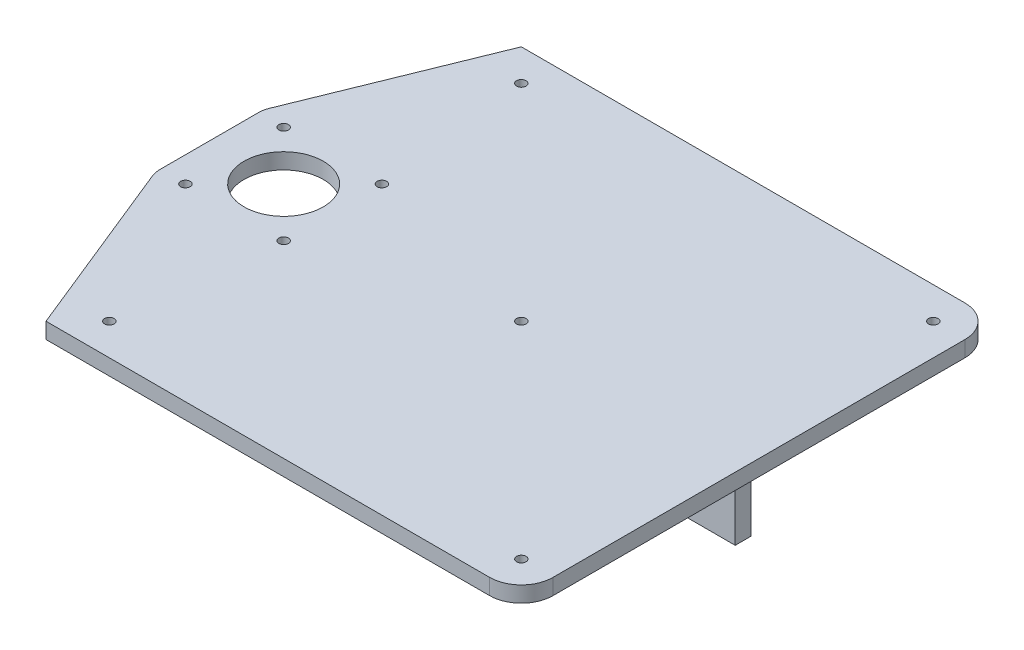
ISO-10303-21;
HEADER;
FILE_DESCRIPTION(('STEP AP214'),'2;1');
FILE_NAME('part.step','',(''),(''),'','','');
FILE_SCHEMA(('AUTOMOTIVE_DESIGN { 1 0 10303 214 1 1 1 1 }'));
ENDSEC;
DATA;
#1=APPLICATION_CONTEXT('core data for automotive mechanical design processes');
#2=APPLICATION_PROTOCOL_DEFINITION('international standard','automotive_design',2000,#1);
#3=PRODUCT_CONTEXT('',#1,'mechanical');
#4=PRODUCT('Part','Part','',(#3));
#5=PRODUCT_RELATED_PRODUCT_CATEGORY('part','',(#4));
#6=PRODUCT_DEFINITION_FORMATION('','',#4);
#7=PRODUCT_DEFINITION_CONTEXT('part definition',#1,'design');
#8=PRODUCT_DEFINITION('design','',#6,#7);
#9=PRODUCT_DEFINITION_SHAPE('','',#8);
#10=(LENGTH_UNIT() NAMED_UNIT(*) SI_UNIT(.MILLI.,.METRE.));
#11=(NAMED_UNIT(*) PLANE_ANGLE_UNIT() SI_UNIT($,.RADIAN.));
#12=(NAMED_UNIT(*) SI_UNIT($,.STERADIAN.) SOLID_ANGLE_UNIT());
#13=UNCERTAINTY_MEASURE_WITH_UNIT(LENGTH_MEASURE(1.E-05),#10,'distance_accuracy_value','');
#14=(GEOMETRIC_REPRESENTATION_CONTEXT(3) GLOBAL_UNCERTAINTY_ASSIGNED_CONTEXT((#13)) GLOBAL_UNIT_ASSIGNED_CONTEXT((#10,
#11,#12)) REPRESENTATION_CONTEXT('',''));
#15=CARTESIAN_POINT('',(0.,0.,0.));
#16=DIRECTION('',(0.,0.,1.));
#17=DIRECTION('',(1.,0.,0.));
#18=AXIS2_PLACEMENT_3D('',#15,#16,#17);
#19=CARTESIAN_POINT('',(65.,5.,65.));
#20=DIRECTION('',(0.,1.,0.));
#21=DIRECTION('',(0.,0.,1.));
#22=AXIS2_PLACEMENT_3D('',#19,#20,#21);
#23=PLANE('',#22);
#24=CARTESIAN_POINT('',(-65.,5.,65.));
#25=DIRECTION('',(0.,1.,0.));
#26=DIRECTION('',(0.,0.,1.));
#27=AXIS2_PLACEMENT_3D('',#24,#25,#26);
#28=CIRCLE('',#27,1.5);
#29=CARTESIAN_POINT('',(-65.,5.,66.5));
#30=VERTEX_POINT('',#29);
#31=EDGE_CURVE('E240',#30,#30,#28,.T.);
#32=ORIENTED_EDGE('',*,*,#31,.F.);
#33=EDGE_LOOP('',(#32));
#34=FACE_BOUND('',#33,.T.);
#35=CARTESIAN_POINT('',(65.,5.,-65.));
#36=DIRECTION('',(0.,1.,0.));
#37=DIRECTION('',(0.,0.,1.));
#38=AXIS2_PLACEMENT_3D('',#35,#36,#37);
#39=CIRCLE('',#38,1.5);
#40=CARTESIAN_POINT('',(65.,5.,-63.5));
#41=VERTEX_POINT('',#40);
#42=EDGE_CURVE('E252',#41,#41,#39,.T.);
#43=ORIENTED_EDGE('',*,*,#42,.F.);
#44=EDGE_LOOP('',(#43));
#45=FACE_BOUND('',#44,.T.);
#46=CARTESIAN_POINT('',(-65.,5.,-65.));
#47=DIRECTION('',(0.,1.,0.));
#48=DIRECTION('',(0.,0.,1.));
#49=AXIS2_PLACEMENT_3D('',#46,#47,#48);
#50=CIRCLE('',#49,1.5);
#51=CARTESIAN_POINT('',(-65.,5.,-63.5));
#52=VERTEX_POINT('',#51);
#53=EDGE_CURVE('E264',#52,#52,#50,.T.);
#54=ORIENTED_EDGE('',*,*,#53,.F.);
#55=EDGE_LOOP('',(#54));
#56=FACE_BOUND('',#55,.T.);
#57=CARTESIAN_POINT('',(-59.5,5.,15.5));
#58=DIRECTION('',(0.,1.,0.));
#59=DIRECTION('',(0.,0.,1.));
#60=AXIS2_PLACEMENT_3D('',#57,#58,#59);
#61=CIRCLE('',#60,1.5);
#62=CARTESIAN_POINT('',(-59.5,5.,17.));
#63=VERTEX_POINT('',#62);
#64=EDGE_CURVE('E276',#63,#63,#61,.T.);
#65=ORIENTED_EDGE('',*,*,#64,.F.);
#66=EDGE_LOOP('',(#65));
#67=FACE_BOUND('',#66,.T.);
#68=CARTESIAN_POINT('',(-90.5,5.,-15.5));
#69=DIRECTION('',(0.,1.,0.));
#70=DIRECTION('',(0.,0.,1.));
#71=AXIS2_PLACEMENT_3D('',#68,#69,#70);
#72=CIRCLE('',#71,1.5);
#73=CARTESIAN_POINT('',(-90.5,5.,-14.));
#74=VERTEX_POINT('',#73);
#75=EDGE_CURVE('E158',#74,#74,#72,.T.);
#76=ORIENTED_EDGE('',*,*,#75,.F.);
#77=EDGE_LOOP('',(#76));
#78=FACE_BOUND('',#77,.T.);
#79=DIRECTION('',(0.375857189718503,0.,0.926677599241996));
#80=VECTOR('',#79,1.);
#81=CARTESIAN_POINT('',(-97.913420793936,5.,18.506857517748));
#82=LINE('',#81,#80);
#83=CARTESIAN_POINT('',(-97.913420793936,5.,18.506857517748));
#84=VERTEX_POINT('',#83);
#85=CARTESIAN_POINT('',(-75.,5.,75.));
#86=VERTEX_POINT('',#85);
#87=EDGE_CURVE('E174',#84,#86,#82,.T.);
#88=ORIENTED_EDGE('',*,*,#87,.T.);
#89=DIRECTION('',(1.,0.,0.));
#90=VECTOR('',#89,1.);
#91=CARTESIAN_POINT('',(-75.,5.,75.));
#92=LINE('',#91,#90);
#93=CARTESIAN_POINT('',(65.,5.,75.));
#94=VERTEX_POINT('',#93);
#95=EDGE_CURVE('E105',#86,#94,#92,.T.);
#96=ORIENTED_EDGE('',*,*,#95,.T.);
#97=CARTESIAN_POINT('',(65.,5.,65.));
#98=DIRECTION('',(0.,1.,0.));
#99=DIRECTION('',(0.,0.,1.));
#100=AXIS2_PLACEMENT_3D('',#97,#98,#99);
#101=CIRCLE('',#100,10.);
#102=CARTESIAN_POINT('',(75.,5.,65.));
#103=VERTEX_POINT('',#102);
#104=EDGE_CURVE('E294',#94,#103,#101,.T.);
#105=ORIENTED_EDGE('',*,*,#104,.T.);
#106=DIRECTION('',(0.,0.,-1.));
#107=VECTOR('',#106,1.);
#108=CARTESIAN_POINT('',(75.,5.,65.));
#109=LINE('',#108,#107);
#110=CARTESIAN_POINT('',(75.,5.,-65.));
#111=VERTEX_POINT('',#110);
#112=EDGE_CURVE('E296',#103,#111,#109,.T.);
#113=ORIENTED_EDGE('',*,*,#112,.T.);
#114=CARTESIAN_POINT('',(65.,5.,-65.));
#115=DIRECTION('',(0.,1.,0.));
#116=DIRECTION('',(0.,0.,-1.));
#117=AXIS2_PLACEMENT_3D('',#114,#115,#116);
#118=CIRCLE('',#117,10.);
#119=CARTESIAN_POINT('',(65.,5.,-75.));
#120=VERTEX_POINT('',#119);
#121=EDGE_CURVE('E298',#111,#120,#118,.T.);
#122=ORIENTED_EDGE('',*,*,#121,.T.);
#123=DIRECTION('',(-1.,0.,0.));
#124=VECTOR('',#123,1.);
#125=CARTESIAN_POINT('',(-75.,5.,-75.));
#126=LINE('',#125,#124);
#127=CARTESIAN_POINT('',(-75.,5.,-75.));
#128=VERTEX_POINT('',#127);
#129=EDGE_CURVE('E300',#120,#128,#126,.T.);
#130=ORIENTED_EDGE('',*,*,#129,.T.);
#131=DIRECTION('',(-0.375857189718503,0.,0.926677599241996));
#132=VECTOR('',#131,1.);
#133=CARTESIAN_POINT('',(-97.913420793936,5.,-18.506857517748));
#134=LINE('',#133,#132);
#135=CARTESIAN_POINT('',(-97.913420793936,5.,-18.506857517748));
#136=VERTEX_POINT('',#135);
#137=EDGE_CURVE('E133',#128,#136,#134,.T.);
#138=ORIENTED_EDGE('',*,*,#137,.T.);
#139=CARTESIAN_POINT('',(-90.5,5.,-15.5));
#140=DIRECTION('',(0.,1.,0.));
#141=DIRECTION('',(0.,0.,-1.));
#142=AXIS2_PLACEMENT_3D('',#139,#140,#141);
#143=CIRCLE('',#142,7.99999999999999);
#144=CARTESIAN_POINT('',(-98.5,5.,-15.5));
#145=VERTEX_POINT('',#144);
#146=EDGE_CURVE('E126',#136,#145,#143,.T.);
#147=ORIENTED_EDGE('',*,*,#146,.T.);
#148=DIRECTION('',(0.,0.,1.));
#149=VECTOR('',#148,1.);
#150=CARTESIAN_POINT('',(-98.5,5.,15.5));
#151=LINE('',#150,#149);
#152=CARTESIAN_POINT('',(-98.5,5.,15.5));
#153=VERTEX_POINT('',#152);
#154=EDGE_CURVE('E130',#145,#153,#151,.T.);
#155=ORIENTED_EDGE('',*,*,#154,.T.);
#156=CARTESIAN_POINT('',(-90.5,5.,15.5));
#157=DIRECTION('',(0.,1.,0.));
#158=DIRECTION('',(0.,0.,1.));
#159=AXIS2_PLACEMENT_3D('',#156,#157,#158);
#160=CIRCLE('',#159,8.00000000000001);
#161=EDGE_CURVE('E57',#153,#84,#160,.T.);
#162=ORIENTED_EDGE('',*,*,#161,.T.);
#163=EDGE_LOOP('',(#88,#96,#105,#113,#122,#130,#138,#147,#155,#162));
#164=FACE_BOUND('',#163,.T.);
#165=CARTESIAN_POINT('',(-90.5,5.,15.5));
#166=DIRECTION('',(0.,1.,0.));
#167=DIRECTION('',(0.,0.,1.));
#168=AXIS2_PLACEMENT_3D('',#165,#166,#167);
#169=CIRCLE('',#168,1.50000000000001);
#170=CARTESIAN_POINT('',(-90.5,5.,17.));
#171=VERTEX_POINT('',#170);
#172=EDGE_CURVE('E282',#171,#171,#169,.T.);
#173=ORIENTED_EDGE('',*,*,#172,.F.);
#174=EDGE_LOOP('',(#173));
#175=FACE_BOUND('',#174,.T.);
#176=CARTESIAN_POINT('',(-59.5,5.,-15.5));
#177=DIRECTION('',(0.,1.,0.));
#178=DIRECTION('',(0.,0.,1.));
#179=AXIS2_PLACEMENT_3D('',#176,#177,#178);
#180=CIRCLE('',#179,1.5);
#181=CARTESIAN_POINT('',(-59.5,5.,-14.));
#182=VERTEX_POINT('',#181);
#183=EDGE_CURVE('E270',#182,#182,#180,.T.);
#184=ORIENTED_EDGE('',*,*,#183,.F.);
#185=EDGE_LOOP('',(#184));
#186=FACE_BOUND('',#185,.T.);
#187=CARTESIAN_POINT('',(-75.,5.,0.));
#188=DIRECTION('',(0.,1.,0.));
#189=DIRECTION('',(0.,0.,1.));
#190=AXIS2_PLACEMENT_3D('',#187,#188,#189);
#191=CIRCLE('',#190,12.5);
#192=CARTESIAN_POINT('',(-75.,5.,12.5));
#193=VERTEX_POINT('',#192);
#194=EDGE_CURVE('E258',#193,#193,#191,.T.);
#195=ORIENTED_EDGE('',*,*,#194,.F.);
#196=EDGE_LOOP('',(#195));
#197=FACE_BOUND('',#196,.T.);
#198=CARTESIAN_POINT('',(65.,5.,65.));
#199=DIRECTION('',(0.,1.,0.));
#200=DIRECTION('',(0.,0.,1.));
#201=AXIS2_PLACEMENT_3D('',#198,#199,#200);
#202=CIRCLE('',#201,1.5);
#203=CARTESIAN_POINT('',(65.,5.,66.5));
#204=VERTEX_POINT('',#203);
#205=EDGE_CURVE('E246',#204,#204,#202,.T.);
#206=ORIENTED_EDGE('',*,*,#205,.F.);
#207=EDGE_LOOP('',(#206));
#208=FACE_BOUND('',#207,.T.);
#209=CARTESIAN_POINT('',(0.,5.,0.));
#210=DIRECTION('',(0.,1.,0.));
#211=DIRECTION('',(0.,0.,1.));
#212=AXIS2_PLACEMENT_3D('',#209,#210,#211);
#213=CIRCLE('',#212,1.5);
#214=CARTESIAN_POINT('',(0.,5.,1.5));
#215=VERTEX_POINT('',#214);
#216=EDGE_CURVE('E234',#215,#215,#213,.T.);
#217=ORIENTED_EDGE('',*,*,#216,.F.);
#218=EDGE_LOOP('',(#217));
#219=FACE_BOUND('',#218,.T.);
#220=ADVANCED_FACE('F33',(#34,#45,#56,#67,#78,#164,#175,#186,#197,#208,#219),#23,.T.);
#221=CARTESIAN_POINT('',(65.,0.,65.));
#222=DIRECTION('',(0.,1.,0.));
#223=DIRECTION('',(0.,0.,1.));
#224=AXIS2_PLACEMENT_3D('',#221,#222,#223);
#225=PLANE('',#224);
#226=DIRECTION('',(1.,0.,0.));
#227=VECTOR('',#226,1.);
#228=CARTESIAN_POINT('',(65.,0.,2.49999999999999));
#229=LINE('',#228,#227);
#230=CARTESIAN_POINT('',(50.,0.,2.49999999999999));
#231=VERTEX_POINT('',#230);
#232=CARTESIAN_POINT('',(70.,0.,2.49999999999999));
#233=VERTEX_POINT('',#232);
#234=EDGE_CURVE('E41',#231,#233,#229,.T.);
#235=ORIENTED_EDGE('',*,*,#234,.T.);
#236=DIRECTION('',(0.,0.,-1.));
#237=VECTOR('',#236,1.);
#238=CARTESIAN_POINT('',(70.0000000000004,0.,65.));
#239=LINE('',#238,#237);
#240=CARTESIAN_POINT('',(70.,0.,-2.50000000000001));
#241=VERTEX_POINT('',#240);
#242=EDGE_CURVE('E11',#233,#241,#239,.T.);
#243=ORIENTED_EDGE('',*,*,#242,.T.);
#244=DIRECTION('',(-1.,0.,0.));
#245=VECTOR('',#244,1.);
#246=CARTESIAN_POINT('',(65.,0.,-2.50000000000002));
#247=LINE('',#246,#245);
#248=CARTESIAN_POINT('',(50.,0.,-2.50000000000001));
#249=VERTEX_POINT('',#248);
#250=EDGE_CURVE('E195',#241,#249,#247,.T.);
#251=ORIENTED_EDGE('',*,*,#250,.T.);
#252=DIRECTION('',(0.,0.,1.));
#253=VECTOR('',#252,1.);
#254=CARTESIAN_POINT('',(50.,0.,65.));
#255=LINE('',#254,#253);
#256=EDGE_CURVE('E198',#249,#231,#255,.T.);
#257=ORIENTED_EDGE('',*,*,#256,.T.);
#258=EDGE_LOOP('',(#235,#243,#251,#257));
#259=FACE_BOUND('',#258,.T.);
#260=DIRECTION('',(0.375857189718503,0.,0.926677599241996));
#261=VECTOR('',#260,1.);
#262=CARTESIAN_POINT('',(-97.913420793936,0.,18.506857517748));
#263=LINE('',#262,#261);
#264=CARTESIAN_POINT('',(-97.913420793936,0.,18.506857517748));
#265=VERTEX_POINT('',#264);
#266=CARTESIAN_POINT('',(-75.,0.,75.));
#267=VERTEX_POINT('',#266);
#268=EDGE_CURVE('E154',#265,#267,#263,.T.);
#269=ORIENTED_EDGE('',*,*,#268,.F.);
#270=CARTESIAN_POINT('',(-90.5,0.,15.5));
#271=DIRECTION('',(0.,1.,0.));
#272=DIRECTION('',(0.,0.,1.));
#273=AXIS2_PLACEMENT_3D('',#270,#271,#272);
#274=CIRCLE('',#273,8.00000000000001);
#275=CARTESIAN_POINT('',(-98.5,0.,15.5));
#276=VERTEX_POINT('',#275);
#277=EDGE_CURVE('E96',#276,#265,#274,.T.);
#278=ORIENTED_EDGE('',*,*,#277,.F.);
#279=DIRECTION('',(0.,0.,1.));
#280=VECTOR('',#279,1.);
#281=CARTESIAN_POINT('',(-98.5,0.,15.5));
#282=LINE('',#281,#280);
#283=CARTESIAN_POINT('',(-98.5,0.,-15.5));
#284=VERTEX_POINT('',#283);
#285=EDGE_CURVE('E171',#284,#276,#282,.T.);
#286=ORIENTED_EDGE('',*,*,#285,.F.);
#287=CARTESIAN_POINT('',(-90.5,0.,-15.5));
#288=DIRECTION('',(0.,1.,0.));
#289=DIRECTION('',(0.,0.,-1.));
#290=AXIS2_PLACEMENT_3D('',#287,#288,#289);
#291=CIRCLE('',#290,7.99999999999999);
#292=CARTESIAN_POINT('',(-97.913420793936,0.,-18.506857517748));
#293=VERTEX_POINT('',#292);
#294=EDGE_CURVE('E142',#293,#284,#291,.T.);
#295=ORIENTED_EDGE('',*,*,#294,.F.);
#296=DIRECTION('',(-0.375857189718503,0.,0.926677599241996));
#297=VECTOR('',#296,1.);
#298=CARTESIAN_POINT('',(-97.913420793936,0.,-18.506857517748));
#299=LINE('',#298,#297);
#300=CARTESIAN_POINT('',(-75.,0.,-75.));
#301=VERTEX_POINT('',#300);
#302=EDGE_CURVE('E168',#301,#293,#299,.T.);
#303=ORIENTED_EDGE('',*,*,#302,.F.);
#304=DIRECTION('',(-1.,0.,0.));
#305=VECTOR('',#304,1.);
#306=CARTESIAN_POINT('',(-75.,0.,-75.));
#307=LINE('',#306,#305);
#308=CARTESIAN_POINT('',(65.,0.,-75.));
#309=VERTEX_POINT('',#308);
#310=EDGE_CURVE('E166',#309,#301,#307,.T.);
#311=ORIENTED_EDGE('',*,*,#310,.F.);
#312=CARTESIAN_POINT('',(65.,0.,-65.));
#313=DIRECTION('',(0.,1.,0.));
#314=DIRECTION('',(0.,0.,-1.));
#315=AXIS2_PLACEMENT_3D('',#312,#313,#314);
#316=CIRCLE('',#315,10.);
#317=CARTESIAN_POINT('',(75.,0.,-65.));
#318=VERTEX_POINT('',#317);
#319=EDGE_CURVE('E164',#318,#309,#316,.T.);
#320=ORIENTED_EDGE('',*,*,#319,.F.);
#321=DIRECTION('',(0.,0.,-1.));
#322=VECTOR('',#321,1.);
#323=CARTESIAN_POINT('',(75.,0.,65.));
#324=LINE('',#323,#322);
#325=CARTESIAN_POINT('',(75.,0.,65.));
#326=VERTEX_POINT('',#325);
#327=EDGE_CURVE('E162',#326,#318,#324,.T.);
#328=ORIENTED_EDGE('',*,*,#327,.F.);
#329=CARTESIAN_POINT('',(65.,0.,65.));
#330=DIRECTION('',(0.,1.,0.));
#331=DIRECTION('',(0.,0.,1.));
#332=AXIS2_PLACEMENT_3D('',#329,#330,#331);
#333=CIRCLE('',#332,10.);
#334=CARTESIAN_POINT('',(65.,0.,75.));
#335=VERTEX_POINT('',#334);
#336=EDGE_CURVE('E160',#335,#326,#333,.T.);
#337=ORIENTED_EDGE('',*,*,#336,.F.);
#338=DIRECTION('',(1.,0.,0.));
#339=VECTOR('',#338,1.);
#340=CARTESIAN_POINT('',(-75.,0.,75.));
#341=LINE('',#340,#339);
#342=EDGE_CURVE('E157',#267,#335,#341,.T.);
#343=ORIENTED_EDGE('',*,*,#342,.F.);
#344=EDGE_LOOP('',(#269,#278,#286,#295,#303,#311,#320,#328,#337,#343));
#345=FACE_BOUND('',#344,.T.);
#346=CARTESIAN_POINT('',(-90.5,0.,-15.5));
#347=DIRECTION('',(0.,1.,0.));
#348=DIRECTION('',(0.,0.,1.));
#349=AXIS2_PLACEMENT_3D('',#346,#347,#348);
#350=CIRCLE('',#349,1.5);
#351=CARTESIAN_POINT('',(-90.5,0.,-14.));
#352=VERTEX_POINT('',#351);
#353=EDGE_CURVE('E285',#352,#352,#350,.T.);
#354=ORIENTED_EDGE('',*,*,#353,.T.);
#355=EDGE_LOOP('',(#354));
#356=FACE_BOUND('',#355,.T.);
#357=CARTESIAN_POINT('',(-90.5,0.,15.5));
#358=DIRECTION('',(0.,1.,0.));
#359=DIRECTION('',(0.,0.,1.));
#360=AXIS2_PLACEMENT_3D('',#357,#358,#359);
#361=CIRCLE('',#360,1.50000000000001);
#362=CARTESIAN_POINT('',(-90.5,0.,17.));
#363=VERTEX_POINT('',#362);
#364=EDGE_CURVE('E279',#363,#363,#361,.T.);
#365=ORIENTED_EDGE('',*,*,#364,.T.);
#366=EDGE_LOOP('',(#365));
#367=FACE_BOUND('',#366,.T.);
#368=CARTESIAN_POINT('',(-59.5,0.,15.5));
#369=DIRECTION('',(0.,1.,0.));
#370=DIRECTION('',(0.,0.,1.));
#371=AXIS2_PLACEMENT_3D('',#368,#369,#370);
#372=CIRCLE('',#371,1.5);
#373=CARTESIAN_POINT('',(-59.5,0.,17.));
#374=VERTEX_POINT('',#373);
#375=EDGE_CURVE('E273',#374,#374,#372,.T.);
#376=ORIENTED_EDGE('',*,*,#375,.T.);
#377=EDGE_LOOP('',(#376));
#378=FACE_BOUND('',#377,.T.);
#379=CARTESIAN_POINT('',(-59.5,0.,-15.5));
#380=DIRECTION('',(0.,1.,0.));
#381=DIRECTION('',(0.,0.,1.));
#382=AXIS2_PLACEMENT_3D('',#379,#380,#381);
#383=CIRCLE('',#382,1.5);
#384=CARTESIAN_POINT('',(-59.5,0.,-14.));
#385=VERTEX_POINT('',#384);
#386=EDGE_CURVE('E267',#385,#385,#383,.T.);
#387=ORIENTED_EDGE('',*,*,#386,.T.);
#388=EDGE_LOOP('',(#387));
#389=FACE_BOUND('',#388,.T.);
#390=CARTESIAN_POINT('',(-65.,0.,-65.));
#391=DIRECTION('',(0.,1.,0.));
#392=DIRECTION('',(0.,0.,1.));
#393=AXIS2_PLACEMENT_3D('',#390,#391,#392);
#394=CIRCLE('',#393,1.5);
#395=CARTESIAN_POINT('',(-65.,0.,-63.5));
#396=VERTEX_POINT('',#395);
#397=EDGE_CURVE('E261',#396,#396,#394,.T.);
#398=ORIENTED_EDGE('',*,*,#397,.T.);
#399=EDGE_LOOP('',(#398));
#400=FACE_BOUND('',#399,.T.);
#401=CARTESIAN_POINT('',(-75.,0.,0.));
#402=DIRECTION('',(0.,1.,0.));
#403=DIRECTION('',(0.,0.,1.));
#404=AXIS2_PLACEMENT_3D('',#401,#402,#403);
#405=CIRCLE('',#404,12.5);
#406=CARTESIAN_POINT('',(-75.,0.,12.5));
#407=VERTEX_POINT('',#406);
#408=EDGE_CURVE('E255',#407,#407,#405,.T.);
#409=ORIENTED_EDGE('',*,*,#408,.T.);
#410=EDGE_LOOP('',(#409));
#411=FACE_BOUND('',#410,.T.);
#412=CARTESIAN_POINT('',(65.,0.,-65.));
#413=DIRECTION('',(0.,1.,0.));
#414=DIRECTION('',(0.,0.,1.));
#415=AXIS2_PLACEMENT_3D('',#412,#413,#414);
#416=CIRCLE('',#415,1.5);
#417=CARTESIAN_POINT('',(65.,0.,-63.5));
#418=VERTEX_POINT('',#417);
#419=EDGE_CURVE('E249',#418,#418,#416,.T.);
#420=ORIENTED_EDGE('',*,*,#419,.T.);
#421=EDGE_LOOP('',(#420));
#422=FACE_BOUND('',#421,.T.);
#423=CARTESIAN_POINT('',(65.,0.,65.));
#424=DIRECTION('',(0.,1.,0.));
#425=DIRECTION('',(0.,0.,1.));
#426=AXIS2_PLACEMENT_3D('',#423,#424,#425);
#427=CIRCLE('',#426,1.5);
#428=CARTESIAN_POINT('',(65.,0.,66.5));
#429=VERTEX_POINT('',#428);
#430=EDGE_CURVE('E243',#429,#429,#427,.T.);
#431=ORIENTED_EDGE('',*,*,#430,.T.);
#432=EDGE_LOOP('',(#431));
#433=FACE_BOUND('',#432,.T.);
#434=CARTESIAN_POINT('',(-65.,0.,65.));
#435=DIRECTION('',(0.,1.,0.));
#436=DIRECTION('',(0.,0.,1.));
#437=AXIS2_PLACEMENT_3D('',#434,#435,#436);
#438=CIRCLE('',#437,1.5);
#439=CARTESIAN_POINT('',(-65.,0.,66.5));
#440=VERTEX_POINT('',#439);
#441=EDGE_CURVE('E237',#440,#440,#438,.T.);
#442=ORIENTED_EDGE('',*,*,#441,.T.);
#443=EDGE_LOOP('',(#442));
#444=FACE_BOUND('',#443,.T.);
#445=CARTESIAN_POINT('',(0.,0.,0.));
#446=DIRECTION('',(0.,1.,0.));
#447=DIRECTION('',(0.,0.,1.));
#448=AXIS2_PLACEMENT_3D('',#445,#446,#447);
#449=CIRCLE('',#448,1.5);
#450=CARTESIAN_POINT('',(0.,0.,1.5));
#451=VERTEX_POINT('',#450);
#452=EDGE_CURVE('E225',#451,#451,#449,.T.);
#453=ORIENTED_EDGE('',*,*,#452,.T.);
#454=EDGE_LOOP('',(#453));
#455=FACE_BOUND('',#454,.T.);
#456=ADVANCED_FACE('F203',(#259,#345,#356,#367,#378,#389,#400,#411,#422,#433,#444,#455),#225,.F.);
#457=CARTESIAN_POINT('',(-97.913420793936,5.,18.506857517748));
#458=DIRECTION('',(0.926677599241996,0.,-0.375857189718503));
#459=DIRECTION('',(-0.375857189718503,0.,-0.926677599241996));
#460=AXIS2_PLACEMENT_3D('',#457,#458,#459);
#461=PLANE('',#460);
#462=ORIENTED_EDGE('',*,*,#268,.T.);
#463=DIRECTION('',(0.,-1.,0.));
#464=VECTOR('',#463,1.);
#465=CARTESIAN_POINT('',(-75.,5.,75.));
#466=LINE('',#465,#464);
#467=EDGE_CURVE('E193',#86,#267,#466,.T.);
#468=ORIENTED_EDGE('',*,*,#467,.F.);
#469=ORIENTED_EDGE('',*,*,#87,.F.);
#470=DIRECTION('',(0.,-1.,0.));
#471=VECTOR('',#470,1.);
#472=CARTESIAN_POINT('',(-97.913420793936,5.,18.506857517748));
#473=LINE('',#472,#471);
#474=EDGE_CURVE('E150',#84,#265,#473,.T.);
#475=ORIENTED_EDGE('',*,*,#474,.T.);
#476=EDGE_LOOP('',(#462,#468,#469,#475));
#477=FACE_BOUND('',#476,.T.);
#478=ADVANCED_FACE('F35',(#477),#461,.F.);
#479=CARTESIAN_POINT('',(-75.,5.,75.));
#480=DIRECTION('',(0.,0.,-1.));
#481=DIRECTION('',(-1.,0.,0.));
#482=AXIS2_PLACEMENT_3D('',#479,#480,#481);
#483=PLANE('',#482);
#484=ORIENTED_EDGE('',*,*,#342,.T.);
#485=DIRECTION('',(0.,-1.,0.));
#486=VECTOR('',#485,1.);
#487=CARTESIAN_POINT('',(65.,5.,75.));
#488=LINE('',#487,#486);
#489=EDGE_CURVE('E190',#94,#335,#488,.T.);
#490=ORIENTED_EDGE('',*,*,#489,.F.);
#491=ORIENTED_EDGE('',*,*,#95,.F.);
#492=ORIENTED_EDGE('',*,*,#467,.T.);
#493=EDGE_LOOP('',(#484,#490,#491,#492));
#494=FACE_BOUND('',#493,.T.);
#495=ADVANCED_FACE('F319',(#494),#483,.F.);
#496=CARTESIAN_POINT('',(65.,5.,65.));
#497=DIRECTION('',(0.,-1.,0.));
#498=DIRECTION('',(0.,0.,-1.));
#499=AXIS2_PLACEMENT_3D('',#496,#497,#498);
#500=CYLINDRICAL_SURFACE('',#499,10.);
#501=ORIENTED_EDGE('',*,*,#336,.T.);
#502=DIRECTION('',(0.,-1.,0.));
#503=VECTOR('',#502,1.);
#504=CARTESIAN_POINT('',(75.,5.,65.));
#505=LINE('',#504,#503);
#506=EDGE_CURVE('E187',#103,#326,#505,.T.);
#507=ORIENTED_EDGE('',*,*,#506,.F.);
#508=ORIENTED_EDGE('',*,*,#104,.F.);
#509=ORIENTED_EDGE('',*,*,#489,.T.);
#510=EDGE_LOOP('',(#501,#507,#508,#509));
#511=FACE_BOUND('',#510,.T.);
#512=ADVANCED_FACE('F322',(#511),#500,.T.);
#513=CARTESIAN_POINT('',(75.,5.,65.));
#514=DIRECTION('',(-1.,0.,0.));
#515=DIRECTION('',(0.,0.,1.));
#516=AXIS2_PLACEMENT_3D('',#513,#514,#515);
#517=PLANE('',#516);
#518=ORIENTED_EDGE('',*,*,#327,.T.);
#519=DIRECTION('',(0.,-1.,0.));
#520=VECTOR('',#519,1.);
#521=CARTESIAN_POINT('',(75.,5.,-65.));
#522=LINE('',#521,#520);
#523=EDGE_CURVE('E184',#111,#318,#522,.T.);
#524=ORIENTED_EDGE('',*,*,#523,.F.);
#525=ORIENTED_EDGE('',*,*,#112,.F.);
#526=ORIENTED_EDGE('',*,*,#506,.T.);
#527=EDGE_LOOP('',(#518,#524,#525,#526));
#528=FACE_BOUND('',#527,.T.);
#529=ADVANCED_FACE('F327',(#528),#517,.F.);
#530=CARTESIAN_POINT('',(65.,5.,-65.));
#531=DIRECTION('',(0.,-1.,0.));
#532=DIRECTION('',(0.,0.,-1.));
#533=AXIS2_PLACEMENT_3D('',#530,#531,#532);
#534=CYLINDRICAL_SURFACE('',#533,10.);
#535=ORIENTED_EDGE('',*,*,#319,.T.);
#536=DIRECTION('',(0.,-1.,0.));
#537=VECTOR('',#536,1.);
#538=CARTESIAN_POINT('',(65.,5.,-75.));
#539=LINE('',#538,#537);
#540=EDGE_CURVE('E181',#120,#309,#539,.T.);
#541=ORIENTED_EDGE('',*,*,#540,.F.);
#542=ORIENTED_EDGE('',*,*,#121,.F.);
#543=ORIENTED_EDGE('',*,*,#523,.T.);
#544=EDGE_LOOP('',(#535,#541,#542,#543));
#545=FACE_BOUND('',#544,.T.);
#546=ADVANCED_FACE('F330',(#545),#534,.T.);
#547=CARTESIAN_POINT('',(-75.,5.,-75.));
#548=DIRECTION('',(0.,0.,1.));
#549=DIRECTION('',(1.,0.,0.));
#550=AXIS2_PLACEMENT_3D('',#547,#548,#549);
#551=PLANE('',#550);
#552=ORIENTED_EDGE('',*,*,#310,.T.);
#553=DIRECTION('',(0.,-1.,0.));
#554=VECTOR('',#553,1.);
#555=CARTESIAN_POINT('',(-75.,5.,-75.));
#556=LINE('',#555,#554);
#557=EDGE_CURVE('E178',#128,#301,#556,.T.);
#558=ORIENTED_EDGE('',*,*,#557,.F.);
#559=ORIENTED_EDGE('',*,*,#129,.F.);
#560=ORIENTED_EDGE('',*,*,#540,.T.);
#561=EDGE_LOOP('',(#552,#558,#559,#560));
#562=FACE_BOUND('',#561,.T.);
#563=ADVANCED_FACE('F306',(#562),#551,.F.);
#564=CARTESIAN_POINT('',(-97.913420793936,5.,-18.506857517748));
#565=DIRECTION('',(0.926677599241996,0.,0.375857189718503));
#566=DIRECTION('',(0.375857189718503,0.,-0.926677599241996));
#567=AXIS2_PLACEMENT_3D('',#564,#565,#566);
#568=PLANE('',#567);
#569=ORIENTED_EDGE('',*,*,#302,.T.);
#570=DIRECTION('',(0.,-1.,0.));
#571=VECTOR('',#570,1.);
#572=CARTESIAN_POINT('',(-97.913420793936,5.,-18.506857517748));
#573=LINE('',#572,#571);
#574=EDGE_CURVE('E145',#136,#293,#573,.T.);
#575=ORIENTED_EDGE('',*,*,#574,.F.);
#576=ORIENTED_EDGE('',*,*,#137,.F.);
#577=ORIENTED_EDGE('',*,*,#557,.T.);
#578=EDGE_LOOP('',(#569,#575,#576,#577));
#579=FACE_BOUND('',#578,.T.);
#580=ADVANCED_FACE('F310',(#579),#568,.F.);
#581=CARTESIAN_POINT('',(-90.5,5.,-15.5));
#582=DIRECTION('',(0.,-1.,0.));
#583=DIRECTION('',(0.,0.,-1.));
#584=AXIS2_PLACEMENT_3D('',#581,#582,#583);
#585=CYLINDRICAL_SURFACE('',#584,7.99999999999999);
#586=ORIENTED_EDGE('',*,*,#294,.T.);
#587=DIRECTION('',(0.,-1.,0.));
#588=VECTOR('',#587,1.);
#589=CARTESIAN_POINT('',(-98.5,5.,-15.5));
#590=LINE('',#589,#588);
#591=EDGE_CURVE('E139',#145,#284,#590,.T.);
#592=ORIENTED_EDGE('',*,*,#591,.F.);
#593=ORIENTED_EDGE('',*,*,#146,.F.);
#594=ORIENTED_EDGE('',*,*,#574,.T.);
#595=EDGE_LOOP('',(#586,#592,#593,#594));
#596=FACE_BOUND('',#595,.T.);
#597=ADVANCED_FACE('F140',(#596),#585,.T.);
#598=CARTESIAN_POINT('',(-98.5,5.,15.5));
#599=DIRECTION('',(1.,0.,0.));
#600=DIRECTION('',(0.,0.,-1.));
#601=AXIS2_PLACEMENT_3D('',#598,#599,#600);
#602=PLANE('',#601);
#603=ORIENTED_EDGE('',*,*,#285,.T.);
#604=DIRECTION('',(0.,-1.,0.));
#605=VECTOR('',#604,1.);
#606=CARTESIAN_POINT('',(-98.5,5.,15.5));
#607=LINE('',#606,#605);
#608=EDGE_CURVE('E146',#153,#276,#607,.T.);
#609=ORIENTED_EDGE('',*,*,#608,.F.);
#610=ORIENTED_EDGE('',*,*,#154,.F.);
#611=ORIENTED_EDGE('',*,*,#591,.T.);
#612=EDGE_LOOP('',(#603,#609,#610,#611));
#613=FACE_BOUND('',#612,.T.);
#614=ADVANCED_FACE('F148',(#613),#602,.F.);
#615=CARTESIAN_POINT('',(-90.5,5.,15.5));
#616=DIRECTION('',(0.,-1.,0.));
#617=DIRECTION('',(0.,0.,-1.));
#618=AXIS2_PLACEMENT_3D('',#615,#616,#617);
#619=CYLINDRICAL_SURFACE('',#618,8.00000000000001);
#620=ORIENTED_EDGE('',*,*,#277,.T.);
#621=ORIENTED_EDGE('',*,*,#474,.F.);
#622=ORIENTED_EDGE('',*,*,#161,.F.);
#623=ORIENTED_EDGE('',*,*,#608,.T.);
#624=EDGE_LOOP('',(#620,#621,#622,#623));
#625=FACE_BOUND('',#624,.T.);
#626=ADVANCED_FACE('F313',(#625),#619,.T.);
#627=CARTESIAN_POINT('',(-90.5,5.,-15.5));
#628=DIRECTION('',(0.,-1.,0.));
#629=DIRECTION('',(0.,0.,-1.));
#630=AXIS2_PLACEMENT_3D('',#627,#628,#629);
#631=CYLINDRICAL_SURFACE('',#630,1.5);
#632=ORIENTED_EDGE('',*,*,#75,.T.);
#633=EDGE_LOOP('',(#632));
#634=FACE_BOUND('',#633,.T.);
#635=ORIENTED_EDGE('',*,*,#353,.F.);
#636=EDGE_LOOP('',(#635));
#637=FACE_BOUND('',#636,.T.);
#638=ADVANCED_FACE('F350',(#634,#637),#631,.F.);
#639=CARTESIAN_POINT('',(-90.5,5.,15.5));
#640=DIRECTION('',(0.,-1.,0.));
#641=DIRECTION('',(0.,0.,-1.));
#642=AXIS2_PLACEMENT_3D('',#639,#640,#641);
#643=CYLINDRICAL_SURFACE('',#642,1.50000000000001);
#644=ORIENTED_EDGE('',*,*,#172,.T.);
#645=EDGE_LOOP('',(#644));
#646=FACE_BOUND('',#645,.T.);
#647=ORIENTED_EDGE('',*,*,#364,.F.);
#648=EDGE_LOOP('',(#647));
#649=FACE_BOUND('',#648,.T.);
#650=ADVANCED_FACE('F382',(#646,#649),#643,.F.);
#651=CARTESIAN_POINT('',(-59.5,5.,15.5));
#652=DIRECTION('',(0.,-1.,0.));
#653=DIRECTION('',(0.,0.,-1.));
#654=AXIS2_PLACEMENT_3D('',#651,#652,#653);
#655=CYLINDRICAL_SURFACE('',#654,1.5);
#656=ORIENTED_EDGE('',*,*,#64,.T.);
#657=EDGE_LOOP('',(#656));
#658=FACE_BOUND('',#657,.T.);
#659=ORIENTED_EDGE('',*,*,#375,.F.);
#660=EDGE_LOOP('',(#659));
#661=FACE_BOUND('',#660,.T.);
#662=ADVANCED_FACE('F389',(#658,#661),#655,.F.);
#663=CARTESIAN_POINT('',(-59.5,5.,-15.5));
#664=DIRECTION('',(0.,-1.,0.));
#665=DIRECTION('',(0.,0.,-1.));
#666=AXIS2_PLACEMENT_3D('',#663,#664,#665);
#667=CYLINDRICAL_SURFACE('',#666,1.5);
#668=ORIENTED_EDGE('',*,*,#183,.T.);
#669=EDGE_LOOP('',(#668));
#670=FACE_BOUND('',#669,.T.);
#671=ORIENTED_EDGE('',*,*,#386,.F.);
#672=EDGE_LOOP('',(#671));
#673=FACE_BOUND('',#672,.T.);
#674=ADVANCED_FACE('F396',(#670,#673),#667,.F.);
#675=CARTESIAN_POINT('',(-65.,5.,-65.));
#676=DIRECTION('',(0.,-1.,0.));
#677=DIRECTION('',(0.,0.,-1.));
#678=AXIS2_PLACEMENT_3D('',#675,#676,#677);
#679=CYLINDRICAL_SURFACE('',#678,1.5);
#680=ORIENTED_EDGE('',*,*,#53,.T.);
#681=EDGE_LOOP('',(#680));
#682=FACE_BOUND('',#681,.T.);
#683=ORIENTED_EDGE('',*,*,#397,.F.);
#684=EDGE_LOOP('',(#683));
#685=FACE_BOUND('',#684,.T.);
#686=ADVANCED_FACE('F404',(#682,#685),#679,.F.);
#687=CARTESIAN_POINT('',(-75.,5.,0.));
#688=DIRECTION('',(0.,-1.,0.));
#689=DIRECTION('',(0.,0.,-1.));
#690=AXIS2_PLACEMENT_3D('',#687,#688,#689);
#691=CYLINDRICAL_SURFACE('',#690,12.5);
#692=ORIENTED_EDGE('',*,*,#194,.T.);
#693=EDGE_LOOP('',(#692));
#694=FACE_BOUND('',#693,.T.);
#695=ORIENTED_EDGE('',*,*,#408,.F.);
#696=EDGE_LOOP('',(#695));
#697=FACE_BOUND('',#696,.T.);
#698=ADVANCED_FACE('F412',(#694,#697),#691,.F.);
#699=CARTESIAN_POINT('',(65.,5.,-65.));
#700=DIRECTION('',(0.,-1.,0.));
#701=DIRECTION('',(0.,0.,-1.));
#702=AXIS2_PLACEMENT_3D('',#699,#700,#701);
#703=CYLINDRICAL_SURFACE('',#702,1.5);
#704=ORIENTED_EDGE('',*,*,#42,.T.);
#705=EDGE_LOOP('',(#704));
#706=FACE_BOUND('',#705,.T.);
#707=ORIENTED_EDGE('',*,*,#419,.F.);
#708=EDGE_LOOP('',(#707));
#709=FACE_BOUND('',#708,.T.);
#710=ADVANCED_FACE('F420',(#706,#709),#703,.F.);
#711=CARTESIAN_POINT('',(65.,5.,65.));
#712=DIRECTION('',(0.,-1.,0.));
#713=DIRECTION('',(0.,0.,-1.));
#714=AXIS2_PLACEMENT_3D('',#711,#712,#713);
#715=CYLINDRICAL_SURFACE('',#714,1.5);
#716=ORIENTED_EDGE('',*,*,#205,.T.);
#717=EDGE_LOOP('',(#716));
#718=FACE_BOUND('',#717,.T.);
#719=ORIENTED_EDGE('',*,*,#430,.F.);
#720=EDGE_LOOP('',(#719));
#721=FACE_BOUND('',#720,.T.);
#722=ADVANCED_FACE('F428',(#718,#721),#715,.F.);
#723=CARTESIAN_POINT('',(-65.,5.,65.));
#724=DIRECTION('',(0.,-1.,0.));
#725=DIRECTION('',(0.,0.,-1.));
#726=AXIS2_PLACEMENT_3D('',#723,#724,#725);
#727=CYLINDRICAL_SURFACE('',#726,1.5);
#728=ORIENTED_EDGE('',*,*,#31,.T.);
#729=EDGE_LOOP('',(#728));
#730=FACE_BOUND('',#729,.T.);
#731=ORIENTED_EDGE('',*,*,#441,.F.);
#732=EDGE_LOOP('',(#731));
#733=FACE_BOUND('',#732,.T.);
#734=ADVANCED_FACE('F436',(#730,#733),#727,.F.);
#735=CARTESIAN_POINT('',(0.,5.,0.));
#736=DIRECTION('',(0.,-1.,0.));
#737=DIRECTION('',(0.,0.,-1.));
#738=AXIS2_PLACEMENT_3D('',#735,#736,#737);
#739=CYLINDRICAL_SURFACE('',#738,1.5);
#740=ORIENTED_EDGE('',*,*,#216,.T.);
#741=EDGE_LOOP('',(#740));
#742=FACE_BOUND('',#741,.T.);
#743=ORIENTED_EDGE('',*,*,#452,.F.);
#744=EDGE_LOOP('',(#743));
#745=FACE_BOUND('',#744,.T.);
#746=ADVANCED_FACE('F444',(#742,#745),#739,.F.);
#747=CARTESIAN_POINT('',(70.,-20.,-2.50000000000001));
#748=DIRECTION('',(1.,0.,0.));
#749=DIRECTION('',(0.,0.,-1.));
#750=AXIS2_PLACEMENT_3D('',#747,#748,#749);
#751=PLANE('',#750);
#752=ORIENTED_EDGE('',*,*,#242,.F.);
#753=DIRECTION('',(0.,1.,0.));
#754=VECTOR('',#753,1.);
#755=CARTESIAN_POINT('',(70.,-20.,2.49999999999999));
#756=LINE('',#755,#754);
#757=CARTESIAN_POINT('',(70.,-20.,2.49999999999999));
#758=VERTEX_POINT('',#757);
#759=EDGE_CURVE('E218',#758,#233,#756,.T.);
#760=ORIENTED_EDGE('',*,*,#759,.F.);
#761=DIRECTION('',(0.,0.,-1.));
#762=VECTOR('',#761,1.);
#763=CARTESIAN_POINT('',(70.,-20.,-2.50000000000001));
#764=LINE('',#763,#762);
#765=CARTESIAN_POINT('',(70.,-20.,-2.50000000000001));
#766=VERTEX_POINT('',#765);
#767=EDGE_CURVE('E577',#758,#766,#764,.T.);
#768=ORIENTED_EDGE('',*,*,#767,.T.);
#769=DIRECTION('',(0.,1.,0.));
#770=VECTOR('',#769,1.);
#771=CARTESIAN_POINT('',(70.,-20.,-2.50000000000001));
#772=LINE('',#771,#770);
#773=EDGE_CURVE('E227',#766,#241,#772,.T.);
#774=ORIENTED_EDGE('',*,*,#773,.T.);
#775=EDGE_LOOP('',(#752,#760,#768,#774));
#776=FACE_BOUND('',#775,.T.);
#777=ADVANCED_FACE('F451',(#776),#751,.T.);
#778=CARTESIAN_POINT('',(70.,-20.,2.49999999999999));
#779=DIRECTION('',(0.,0.,1.));
#780=DIRECTION('',(1.,0.,0.));
#781=AXIS2_PLACEMENT_3D('',#778,#779,#780);
#782=PLANE('',#781);
#783=ORIENTED_EDGE('',*,*,#234,.F.);
#784=DIRECTION('',(0.,1.,0.));
#785=VECTOR('',#784,1.);
#786=CARTESIAN_POINT('',(50.,-20.,2.49999999999999));
#787=LINE('',#786,#785);
#788=CARTESIAN_POINT('',(50.,-20.,2.49999999999999));
#789=VERTEX_POINT('',#788);
#790=EDGE_CURVE('E215',#789,#231,#787,.T.);
#791=ORIENTED_EDGE('',*,*,#790,.F.);
#792=DIRECTION('',(1.,0.,0.));
#793=VECTOR('',#792,1.);
#794=CARTESIAN_POINT('',(70.,-20.,2.49999999999999));
#795=LINE('',#794,#793);
#796=EDGE_CURVE('E233',#789,#758,#795,.T.);
#797=ORIENTED_EDGE('',*,*,#796,.T.);
#798=ORIENTED_EDGE('',*,*,#759,.T.);
#799=EDGE_LOOP('',(#783,#791,#797,#798));
#800=FACE_BOUND('',#799,.T.);
#801=ADVANCED_FACE('F212',(#800),#782,.T.);
#802=CARTESIAN_POINT('',(50.,-20.,-2.50000000000001));
#803=DIRECTION('',(-1.,0.,0.));
#804=DIRECTION('',(0.,0.,1.));
#805=AXIS2_PLACEMENT_3D('',#802,#803,#804);
#806=PLANE('',#805);
#807=ORIENTED_EDGE('',*,*,#256,.F.);
#808=DIRECTION('',(0.,1.,0.));
#809=VECTOR('',#808,1.);
#810=CARTESIAN_POINT('',(50.,-20.,-2.50000000000001));
#811=LINE('',#810,#809);
#812=CARTESIAN_POINT('',(50.,-20.,-2.50000000000001));
#813=VERTEX_POINT('',#812);
#814=EDGE_CURVE('E48',#813,#249,#811,.T.);
#815=ORIENTED_EDGE('',*,*,#814,.F.);
#816=DIRECTION('',(0.,0.,1.));
#817=VECTOR('',#816,1.);
#818=CARTESIAN_POINT('',(50.,-20.,-2.50000000000001));
#819=LINE('',#818,#817);
#820=EDGE_CURVE('E222',#813,#789,#819,.T.);
#821=ORIENTED_EDGE('',*,*,#820,.T.);
#822=ORIENTED_EDGE('',*,*,#790,.T.);
#823=EDGE_LOOP('',(#807,#815,#821,#822));
#824=FACE_BOUND('',#823,.T.);
#825=ADVANCED_FACE('F220',(#824),#806,.T.);
#826=CARTESIAN_POINT('',(70.,-20.,-2.50000000000001));
#827=DIRECTION('',(0.,0.,-1.));
#828=DIRECTION('',(-1.,0.,0.));
#829=AXIS2_PLACEMENT_3D('',#826,#827,#828);
#830=PLANE('',#829);
#831=ORIENTED_EDGE('',*,*,#250,.F.);
#832=ORIENTED_EDGE('',*,*,#773,.F.);
#833=DIRECTION('',(-1.,0.,0.));
#834=VECTOR('',#833,1.);
#835=CARTESIAN_POINT('',(70.,-20.,-2.50000000000001));
#836=LINE('',#835,#834);
#837=EDGE_CURVE('E579',#766,#813,#836,.T.);
#838=ORIENTED_EDGE('',*,*,#837,.T.);
#839=ORIENTED_EDGE('',*,*,#814,.T.);
#840=EDGE_LOOP('',(#831,#832,#838,#839));
#841=FACE_BOUND('',#840,.T.);
#842=ADVANCED_FACE('F472',(#841),#830,.T.);
#843=CARTESIAN_POINT('',(0.,-20.,0.));
#844=DIRECTION('',(0.,-1.,0.));
#845=DIRECTION('',(0.,0.,-1.));
#846=AXIS2_PLACEMENT_3D('',#843,#844,#845);
#847=PLANE('',#846);
#848=ORIENTED_EDGE('',*,*,#767,.F.);
#849=ORIENTED_EDGE('',*,*,#796,.F.);
#850=ORIENTED_EDGE('',*,*,#820,.F.);
#851=ORIENTED_EDGE('',*,*,#837,.F.);
#852=EDGE_LOOP('',(#848,#849,#850,#851));
#853=FACE_BOUND('',#852,.T.);
#854=ADVANCED_FACE('F479',(#853),#847,.T.);
#855=CLOSED_SHELL('',(#220,#456,#478,#495,#512,#529,#546,#563,#580,#597,#614,#626,#638,#650,
#662,#674,#686,#698,#710,#722,#734,#746,#777,#801,#825,#842,#854));
#856=MANIFOLD_SOLID_BREP('B2',#855);
#857=ADVANCED_BREP_SHAPE_REPRESENTATION('',(#18,#856),#14);
#858=SHAPE_DEFINITION_REPRESENTATION(#9,#857);
ENDSEC;
END-ISO-10303-21;
